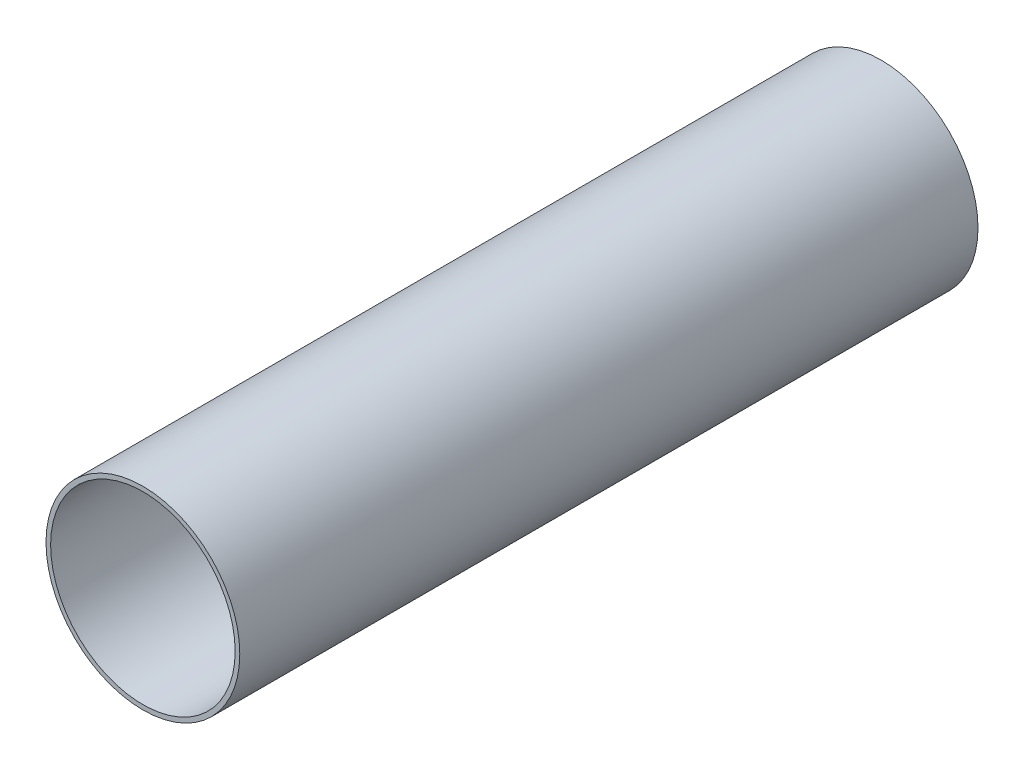
ISO-10303-21;
HEADER;
FILE_DESCRIPTION(('STEP AP214'),'2;1');
FILE_NAME('part.step','',(''),(''),'','','');
FILE_SCHEMA(('AUTOMOTIVE_DESIGN { 1 0 10303 214 1 1 1 1 }'));
ENDSEC;
DATA;
#1=APPLICATION_CONTEXT('core data for automotive mechanical design processes');
#2=APPLICATION_PROTOCOL_DEFINITION('international standard','automotive_design',2000,#1);
#3=PRODUCT_CONTEXT('',#1,'mechanical');
#4=PRODUCT('Part','Part','',(#3));
#5=PRODUCT_RELATED_PRODUCT_CATEGORY('part','',(#4));
#6=PRODUCT_DEFINITION_FORMATION('','',#4);
#7=PRODUCT_DEFINITION_CONTEXT('part definition',#1,'design');
#8=PRODUCT_DEFINITION('design','',#6,#7);
#9=PRODUCT_DEFINITION_SHAPE('','',#8);
#10=(LENGTH_UNIT() NAMED_UNIT(*) SI_UNIT(.MILLI.,.METRE.));
#11=(NAMED_UNIT(*) PLANE_ANGLE_UNIT() SI_UNIT($,.RADIAN.));
#12=(NAMED_UNIT(*) SI_UNIT($,.STERADIAN.) SOLID_ANGLE_UNIT());
#13=UNCERTAINTY_MEASURE_WITH_UNIT(LENGTH_MEASURE(1.E-05),#10,'distance_accuracy_value','');
#14=(GEOMETRIC_REPRESENTATION_CONTEXT(3) GLOBAL_UNCERTAINTY_ASSIGNED_CONTEXT((#13)) GLOBAL_UNIT_ASSIGNED_CONTEXT((#10,
#11,#12)) REPRESENTATION_CONTEXT('',''));
#15=CARTESIAN_POINT('',(0.,0.,0.));
#16=DIRECTION('',(0.,0.,1.));
#17=DIRECTION('',(1.,0.,0.));
#18=AXIS2_PLACEMENT_3D('',#15,#16,#17);
#19=CARTESIAN_POINT('',(0.,0.,406.4));
#20=DIRECTION('',(0.,0.,1.));
#21=DIRECTION('',(1.,0.,0.));
#22=AXIS2_PLACEMENT_3D('',#19,#20,#21);
#23=PLANE('',#22);
#24=CARTESIAN_POINT('',(0.,0.,406.4));
#25=DIRECTION('',(0.,0.,1.));
#26=DIRECTION('',(1.,0.,0.));
#27=AXIS2_PLACEMENT_3D('',#24,#25,#26);
#28=CIRCLE('',#27,53.34);
#29=CARTESIAN_POINT('',(53.34,0.,406.4));
#30=VERTEX_POINT('',#29);
#31=EDGE_CURVE('E10',#30,#30,#28,.T.);
#32=ORIENTED_EDGE('',*,*,#31,.T.);
#33=EDGE_LOOP('',(#32));
#34=FACE_BOUND('',#33,.T.);
#35=CARTESIAN_POINT('',(0.,0.,406.4));
#36=DIRECTION('',(0.,0.,1.));
#37=DIRECTION('',(1.,0.,0.));
#38=AXIS2_PLACEMENT_3D('',#35,#36,#37);
#39=CIRCLE('',#38,50.8);
#40=CARTESIAN_POINT('',(50.8,0.,406.4));
#41=VERTEX_POINT('',#40);
#42=EDGE_CURVE('E56',#41,#41,#39,.T.);
#43=ORIENTED_EDGE('',*,*,#42,.F.);
#44=EDGE_LOOP('',(#43));
#45=FACE_BOUND('',#44,.T.);
#46=ADVANCED_FACE('F43',(#34,#45),#23,.T.);
#47=CARTESIAN_POINT('',(0.,0.,0.));
#48=DIRECTION('',(0.,0.,1.));
#49=DIRECTION('',(1.,0.,0.));
#50=AXIS2_PLACEMENT_3D('',#47,#48,#49);
#51=PLANE('',#50);
#52=CARTESIAN_POINT('',(0.,0.,0.));
#53=DIRECTION('',(0.,0.,1.));
#54=DIRECTION('',(1.,0.,0.));
#55=AXIS2_PLACEMENT_3D('',#52,#53,#54);
#56=CIRCLE('',#55,53.34);
#57=CARTESIAN_POINT('',(53.34,0.,0.));
#58=VERTEX_POINT('',#57);
#59=EDGE_CURVE('E47',#58,#58,#56,.T.);
#60=ORIENTED_EDGE('',*,*,#59,.F.);
#61=EDGE_LOOP('',(#60));
#62=FACE_BOUND('',#61,.T.);
#63=CARTESIAN_POINT('',(0.,0.,0.));
#64=DIRECTION('',(0.,0.,1.));
#65=DIRECTION('',(1.,0.,0.));
#66=AXIS2_PLACEMENT_3D('',#63,#64,#65);
#67=CIRCLE('',#66,50.8);
#68=CARTESIAN_POINT('',(50.8,0.,0.));
#69=VERTEX_POINT('',#68);
#70=EDGE_CURVE('E58',#69,#69,#67,.T.);
#71=ORIENTED_EDGE('',*,*,#70,.T.);
#72=EDGE_LOOP('',(#71));
#73=FACE_BOUND('',#72,.T.);
#74=ADVANCED_FACE('F70',(#62,#73),#51,.F.);
#75=CARTESIAN_POINT('',(0.,0.,406.4));
#76=DIRECTION('',(0.,0.,-1.));
#77=DIRECTION('',(-1.,0.,0.));
#78=AXIS2_PLACEMENT_3D('',#75,#76,#77);
#79=CYLINDRICAL_SURFACE('',#78,53.34);
#80=ORIENTED_EDGE('',*,*,#31,.F.);
#81=EDGE_LOOP('',(#80));
#82=FACE_BOUND('',#81,.T.);
#83=ORIENTED_EDGE('',*,*,#59,.T.);
#84=EDGE_LOOP('',(#83));
#85=FACE_BOUND('',#84,.T.);
#86=ADVANCED_FACE('F45',(#82,#85),#79,.T.);
#87=CARTESIAN_POINT('',(0.,0.,406.4));
#88=DIRECTION('',(0.,0.,-1.));
#89=DIRECTION('',(-1.,0.,0.));
#90=AXIS2_PLACEMENT_3D('',#87,#88,#89);
#91=CYLINDRICAL_SURFACE('',#90,50.8);
#92=ORIENTED_EDGE('',*,*,#42,.T.);
#93=EDGE_LOOP('',(#92));
#94=FACE_BOUND('',#93,.T.);
#95=ORIENTED_EDGE('',*,*,#70,.F.);
#96=EDGE_LOOP('',(#95));
#97=FACE_BOUND('',#96,.T.);
#98=ADVANCED_FACE('F66',(#94,#97),#91,.F.);
#99=CLOSED_SHELL('',(#46,#74,#86,#98));
#100=MANIFOLD_SOLID_BREP('B2',#99);
#101=ADVANCED_BREP_SHAPE_REPRESENTATION('',(#18,#100),#14);
#102=SHAPE_DEFINITION_REPRESENTATION(#9,#101);
ENDSEC;
END-ISO-10303-21;
